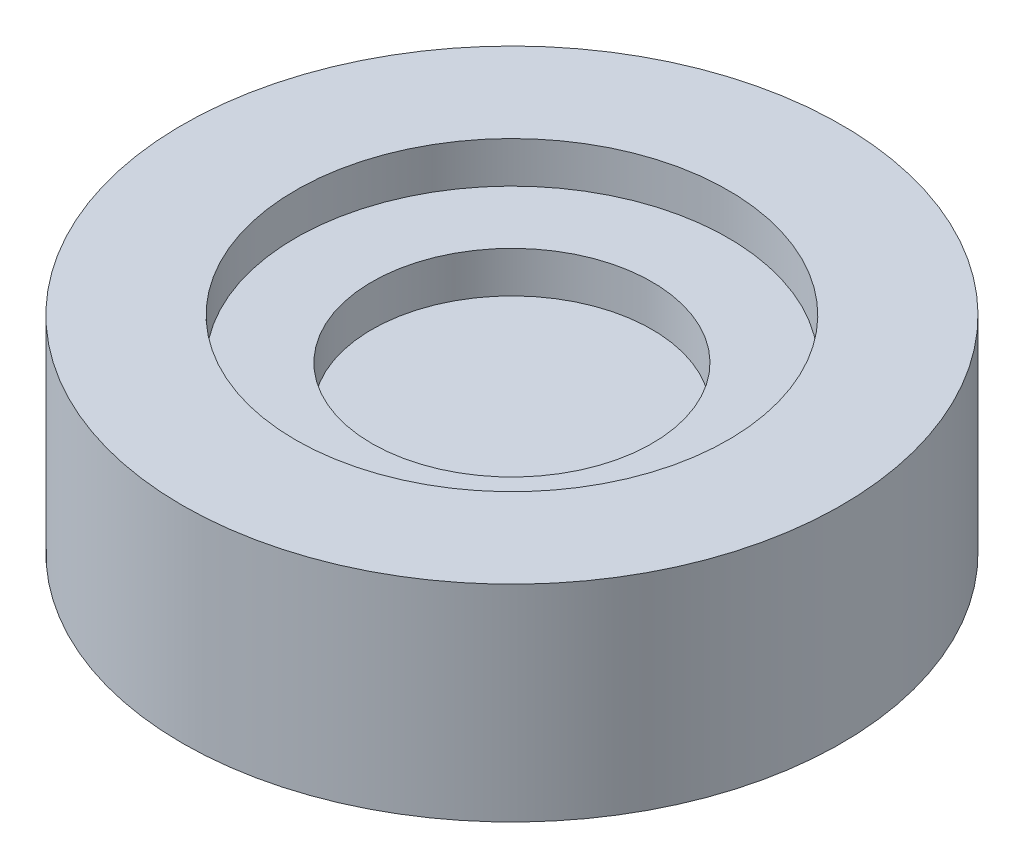
ISO-10303-21;
HEADER;
FILE_DESCRIPTION(('STEP AP214'),'2;1');
FILE_NAME('part.step','',(''),(''),'','','');
FILE_SCHEMA(('AUTOMOTIVE_DESIGN { 1 0 10303 214 1 1 1 1 }'));
ENDSEC;
DATA;
#1=APPLICATION_CONTEXT('core data for automotive mechanical design processes');
#2=APPLICATION_PROTOCOL_DEFINITION('international standard','automotive_design',2000,#1);
#3=PRODUCT_CONTEXT('',#1,'mechanical');
#4=PRODUCT('Part','Part','',(#3));
#5=PRODUCT_RELATED_PRODUCT_CATEGORY('part','',(#4));
#6=PRODUCT_DEFINITION_FORMATION('','',#4);
#7=PRODUCT_DEFINITION_CONTEXT('part definition',#1,'design');
#8=PRODUCT_DEFINITION('design','',#6,#7);
#9=PRODUCT_DEFINITION_SHAPE('','',#8);
#10=(LENGTH_UNIT() NAMED_UNIT(*) SI_UNIT(.MILLI.,.METRE.));
#11=(NAMED_UNIT(*) PLANE_ANGLE_UNIT() SI_UNIT($,.RADIAN.));
#12=(NAMED_UNIT(*) SI_UNIT($,.STERADIAN.) SOLID_ANGLE_UNIT());
#13=UNCERTAINTY_MEASURE_WITH_UNIT(LENGTH_MEASURE(1.E-05),#10,'distance_accuracy_value','');
#14=(GEOMETRIC_REPRESENTATION_CONTEXT(3) GLOBAL_UNCERTAINTY_ASSIGNED_CONTEXT((#13)) GLOBAL_UNIT_ASSIGNED_CONTEXT((#10,
#11,#12)) REPRESENTATION_CONTEXT('',''));
#15=CARTESIAN_POINT('',(0.,0.,0.));
#16=DIRECTION('',(0.,0.,1.));
#17=DIRECTION('',(1.,0.,0.));
#18=AXIS2_PLACEMENT_3D('',#15,#16,#17);
#19=CARTESIAN_POINT('',(0.,5.,0.));
#20=DIRECTION('',(0.,-1.,0.));
#21=DIRECTION('',(0.,0.,-1.));
#22=AXIS2_PLACEMENT_3D('',#19,#20,#21);
#23=CYLINDRICAL_SURFACE('',#22,8.);
#24=CARTESIAN_POINT('',(0.,5.,0.));
#25=DIRECTION('',(0.,1.,0.));
#26=DIRECTION('',(0.,0.,1.));
#27=AXIS2_PLACEMENT_3D('',#24,#25,#26);
#28=CIRCLE('',#27,8.);
#29=CARTESIAN_POINT('',(0.,5.,8.));
#30=VERTEX_POINT('',#29);
#31=EDGE_CURVE('E11',#30,#30,#28,.T.);
#32=ORIENTED_EDGE('',*,*,#31,.F.);
#33=EDGE_LOOP('',(#32));
#34=FACE_BOUND('',#33,.T.);
#35=CARTESIAN_POINT('',(0.,0.,0.));
#36=DIRECTION('',(0.,1.,0.));
#37=DIRECTION('',(0.,0.,1.));
#38=AXIS2_PLACEMENT_3D('',#35,#36,#37);
#39=CIRCLE('',#38,8.);
#40=CARTESIAN_POINT('',(0.,0.,8.));
#41=VERTEX_POINT('',#40);
#42=EDGE_CURVE('E37',#41,#41,#39,.T.);
#43=ORIENTED_EDGE('',*,*,#42,.T.);
#44=EDGE_LOOP('',(#43));
#45=FACE_BOUND('',#44,.T.);
#46=ADVANCED_FACE('F34',(#34,#45),#23,.T.);
#47=CARTESIAN_POINT('',(0.,5.,0.));
#48=DIRECTION('',(0.,1.,0.));
#49=DIRECTION('',(0.,0.,1.));
#50=AXIS2_PLACEMENT_3D('',#47,#48,#49);
#51=PLANE('',#50);
#52=CARTESIAN_POINT('',(0.,5.,0.));
#53=DIRECTION('',(0.,1.,0.));
#54=DIRECTION('',(0.,0.,1.));
#55=AXIS2_PLACEMENT_3D('',#52,#53,#54);
#56=CIRCLE('',#55,5.25);
#57=CARTESIAN_POINT('',(0.,5.,5.25));
#58=VERTEX_POINT('',#57);
#59=EDGE_CURVE('E173',#58,#58,#56,.T.);
#60=ORIENTED_EDGE('',*,*,#59,.F.);
#61=EDGE_LOOP('',(#60));
#62=FACE_BOUND('',#61,.T.);
#63=ORIENTED_EDGE('',*,*,#31,.T.);
#64=EDGE_LOOP('',(#63));
#65=FACE_BOUND('',#64,.T.);
#66=ADVANCED_FACE('F128',(#62,#65),#51,.T.);
#67=CARTESIAN_POINT('',(0.,0.,0.));
#68=DIRECTION('',(0.,1.,0.));
#69=DIRECTION('',(0.,0.,1.));
#70=AXIS2_PLACEMENT_3D('',#67,#68,#69);
#71=PLANE('',#70);
#72=DIRECTION('',(-1.,0.,0.));
#73=VECTOR('',#72,1.);
#74=CARTESIAN_POINT('',(-3.2,0.,1.6));
#75=LINE('',#74,#73);
#76=CARTESIAN_POINT('',(3.2,0.,1.6));
#77=VERTEX_POINT('',#76);
#78=CARTESIAN_POINT('',(-3.2,0.,1.6));
#79=VERTEX_POINT('',#78);
#80=EDGE_CURVE('E83',#77,#79,#75,.T.);
#81=ORIENTED_EDGE('',*,*,#80,.F.);
#82=DIRECTION('',(0.,0.,1.));
#83=VECTOR('',#82,1.);
#84=CARTESIAN_POINT('',(3.2,0.,-1.6));
#85=LINE('',#84,#83);
#86=CARTESIAN_POINT('',(3.2,0.,-1.6));
#87=VERTEX_POINT('',#86);
#88=EDGE_CURVE('E48',#87,#77,#85,.T.);
#89=ORIENTED_EDGE('',*,*,#88,.F.);
#90=DIRECTION('',(1.,0.,0.));
#91=VECTOR('',#90,1.);
#92=CARTESIAN_POINT('',(-3.2,0.,-1.6));
#93=LINE('',#92,#91);
#94=CARTESIAN_POINT('',(-3.2,0.,-1.6));
#95=VERTEX_POINT('',#94);
#96=EDGE_CURVE('E99',#95,#87,#93,.T.);
#97=ORIENTED_EDGE('',*,*,#96,.F.);
#98=DIRECTION('',(0.,0.,-1.));
#99=VECTOR('',#98,1.);
#100=CARTESIAN_POINT('',(-3.2,0.,-1.6));
#101=LINE('',#100,#99);
#102=EDGE_CURVE('E107',#79,#95,#101,.T.);
#103=ORIENTED_EDGE('',*,*,#102,.F.);
#104=EDGE_LOOP('',(#81,#89,#97,#103));
#105=FACE_BOUND('',#104,.T.);
#106=ORIENTED_EDGE('',*,*,#42,.F.);
#107=EDGE_LOOP('',(#106));
#108=FACE_BOUND('',#107,.T.);
#109=ADVANCED_FACE('F113',(#105,#108),#71,.F.);
#110=CARTESIAN_POINT('',(3.2,2.,-1.6));
#111=DIRECTION('',(1.,0.,0.));
#112=DIRECTION('',(0.,0.,-1.));
#113=AXIS2_PLACEMENT_3D('',#110,#111,#112);
#114=PLANE('',#113);
#115=ORIENTED_EDGE('',*,*,#88,.T.);
#116=DIRECTION('',(0.,-1.,0.));
#117=VECTOR('',#116,1.);
#118=CARTESIAN_POINT('',(3.2,2.,1.6));
#119=LINE('',#118,#117);
#120=CARTESIAN_POINT('',(3.2,2.,1.6));
#121=VERTEX_POINT('',#120);
#122=EDGE_CURVE('E71',#121,#77,#119,.T.);
#123=ORIENTED_EDGE('',*,*,#122,.F.);
#124=DIRECTION('',(0.,0.,1.));
#125=VECTOR('',#124,1.);
#126=CARTESIAN_POINT('',(3.2,2.,-1.6));
#127=LINE('',#126,#125);
#128=CARTESIAN_POINT('',(3.2,2.,-1.6));
#129=VERTEX_POINT('',#128);
#130=EDGE_CURVE('E97',#129,#121,#127,.T.);
#131=ORIENTED_EDGE('',*,*,#130,.F.);
#132=DIRECTION('',(0.,-1.,0.));
#133=VECTOR('',#132,1.);
#134=CARTESIAN_POINT('',(3.2,2.,-1.6));
#135=LINE('',#134,#133);
#136=EDGE_CURVE('E56',#129,#87,#135,.T.);
#137=ORIENTED_EDGE('',*,*,#136,.T.);
#138=EDGE_LOOP('',(#115,#123,#131,#137));
#139=FACE_BOUND('',#138,.T.);
#140=ADVANCED_FACE('F118',(#139),#114,.F.);
#141=CARTESIAN_POINT('',(-3.2,2.,-1.6));
#142=DIRECTION('',(0.,0.,-1.));
#143=DIRECTION('',(-1.,0.,0.));
#144=AXIS2_PLACEMENT_3D('',#141,#142,#143);
#145=PLANE('',#144);
#146=ORIENTED_EDGE('',*,*,#96,.T.);
#147=ORIENTED_EDGE('',*,*,#136,.F.);
#148=DIRECTION('',(1.,0.,0.));
#149=VECTOR('',#148,1.);
#150=CARTESIAN_POINT('',(-3.2,2.,-1.6));
#151=LINE('',#150,#149);
#152=CARTESIAN_POINT('',(-3.2,2.,-1.6));
#153=VERTEX_POINT('',#152);
#154=EDGE_CURVE('E94',#153,#129,#151,.T.);
#155=ORIENTED_EDGE('',*,*,#154,.F.);
#156=DIRECTION('',(0.,-1.,0.));
#157=VECTOR('',#156,1.);
#158=CARTESIAN_POINT('',(-3.2,2.,-1.6));
#159=LINE('',#158,#157);
#160=EDGE_CURVE('E87',#153,#95,#159,.T.);
#161=ORIENTED_EDGE('',*,*,#160,.T.);
#162=EDGE_LOOP('',(#146,#147,#155,#161));
#163=FACE_BOUND('',#162,.T.);
#164=ADVANCED_FACE('F116',(#163),#145,.F.);
#165=CARTESIAN_POINT('',(-3.2,2.,-1.6));
#166=DIRECTION('',(-1.,0.,0.));
#167=DIRECTION('',(0.,0.,1.));
#168=AXIS2_PLACEMENT_3D('',#165,#166,#167);
#169=PLANE('',#168);
#170=ORIENTED_EDGE('',*,*,#102,.T.);
#171=ORIENTED_EDGE('',*,*,#160,.F.);
#172=DIRECTION('',(0.,0.,-1.));
#173=VECTOR('',#172,1.);
#174=CARTESIAN_POINT('',(-3.2,2.,-1.6));
#175=LINE('',#174,#173);
#176=CARTESIAN_POINT('',(-3.2,2.,1.6));
#177=VERTEX_POINT('',#176);
#178=EDGE_CURVE('E90',#177,#153,#175,.T.);
#179=ORIENTED_EDGE('',*,*,#178,.F.);
#180=DIRECTION('',(0.,-1.,0.));
#181=VECTOR('',#180,1.);
#182=CARTESIAN_POINT('',(-3.2,2.,1.6));
#183=LINE('',#182,#181);
#184=EDGE_CURVE('E76',#177,#79,#183,.T.);
#185=ORIENTED_EDGE('',*,*,#184,.T.);
#186=EDGE_LOOP('',(#170,#171,#179,#185));
#187=FACE_BOUND('',#186,.T.);
#188=ADVANCED_FACE('F91',(#187),#169,.F.);
#189=CARTESIAN_POINT('',(-3.2,2.,1.6));
#190=DIRECTION('',(0.,0.,1.));
#191=DIRECTION('',(1.,0.,0.));
#192=AXIS2_PLACEMENT_3D('',#189,#190,#191);
#193=PLANE('',#192);
#194=ORIENTED_EDGE('',*,*,#80,.T.);
#195=ORIENTED_EDGE('',*,*,#184,.F.);
#196=DIRECTION('',(-1.,0.,0.));
#197=VECTOR('',#196,1.);
#198=CARTESIAN_POINT('',(-3.2,2.,1.6));
#199=LINE('',#198,#197);
#200=EDGE_CURVE('E80',#121,#177,#199,.T.);
#201=ORIENTED_EDGE('',*,*,#200,.F.);
#202=ORIENTED_EDGE('',*,*,#122,.T.);
#203=EDGE_LOOP('',(#194,#195,#201,#202));
#204=FACE_BOUND('',#203,.T.);
#205=ADVANCED_FACE('F78',(#204),#193,.F.);
#206=CARTESIAN_POINT('',(0.,2.,0.));
#207=DIRECTION('',(0.,1.,0.));
#208=DIRECTION('',(0.,0.,1.));
#209=AXIS2_PLACEMENT_3D('',#206,#207,#208);
#210=PLANE('',#209);
#211=ORIENTED_EDGE('',*,*,#130,.T.);
#212=ORIENTED_EDGE('',*,*,#200,.T.);
#213=ORIENTED_EDGE('',*,*,#178,.T.);
#214=ORIENTED_EDGE('',*,*,#154,.T.);
#215=EDGE_LOOP('',(#211,#212,#213,#214));
#216=FACE_BOUND('',#215,.T.);
#217=ADVANCED_FACE('F96',(#216),#210,.F.);
#218=CARTESIAN_POINT('',(0.,3.,0.));
#219=DIRECTION('',(0.,-1.,0.));
#220=DIRECTION('',(0.,0.,-1.));
#221=AXIS2_PLACEMENT_3D('',#218,#219,#220);
#222=PLANE('',#221);
#223=CARTESIAN_POINT('',(0.,3.,0.));
#224=DIRECTION('',(0.,1.,0.));
#225=DIRECTION('',(0.,0.,1.));
#226=AXIS2_PLACEMENT_3D('',#223,#224,#225);
#227=CIRCLE('',#226,3.4);
#228=CARTESIAN_POINT('',(0.,3.,3.4));
#229=VERTEX_POINT('',#228);
#230=EDGE_CURVE('E105',#229,#229,#227,.T.);
#231=ORIENTED_EDGE('',*,*,#230,.T.);
#232=EDGE_LOOP('',(#231));
#233=FACE_BOUND('',#232,.T.);
#234=ADVANCED_FACE('F147',(#233),#222,.F.);
#235=CARTESIAN_POINT('',(0.,0.,0.));
#236=DIRECTION('',(0.,1.,0.));
#237=DIRECTION('',(0.,0.,1.));
#238=AXIS2_PLACEMENT_3D('',#235,#236,#237);
#239=CYLINDRICAL_SURFACE('',#238,3.4);
#240=ORIENTED_EDGE('',*,*,#230,.F.);
#241=EDGE_LOOP('',(#240));
#242=FACE_BOUND('',#241,.T.);
#243=CARTESIAN_POINT('',(0.,4.,0.));
#244=DIRECTION('',(0.,1.,0.));
#245=DIRECTION('',(0.,0.,1.));
#246=AXIS2_PLACEMENT_3D('',#243,#244,#245);
#247=CIRCLE('',#246,3.4);
#248=CARTESIAN_POINT('',(0.,4.,3.4));
#249=VERTEX_POINT('',#248);
#250=EDGE_CURVE('E175',#249,#249,#247,.T.);
#251=ORIENTED_EDGE('',*,*,#250,.T.);
#252=EDGE_LOOP('',(#251));
#253=FACE_BOUND('',#252,.T.);
#254=ADVANCED_FACE('F151',(#242,#253),#239,.F.);
#255=CARTESIAN_POINT('',(-3.4,4.,0.));
#256=DIRECTION('',(0.,-1.,0.));
#257=DIRECTION('',(0.,0.,-1.));
#258=AXIS2_PLACEMENT_3D('',#255,#256,#257);
#259=PLANE('',#258);
#260=ORIENTED_EDGE('',*,*,#250,.F.);
#261=EDGE_LOOP('',(#260));
#262=FACE_BOUND('',#261,.T.);
#263=CARTESIAN_POINT('',(0.,4.,0.));
#264=DIRECTION('',(0.,1.,0.));
#265=DIRECTION('',(0.,0.,1.));
#266=AXIS2_PLACEMENT_3D('',#263,#264,#265);
#267=CIRCLE('',#266,5.25);
#268=CARTESIAN_POINT('',(0.,4.,5.25));
#269=VERTEX_POINT('',#268);
#270=EDGE_CURVE('E170',#269,#269,#267,.T.);
#271=ORIENTED_EDGE('',*,*,#270,.T.);
#272=EDGE_LOOP('',(#271));
#273=FACE_BOUND('',#272,.T.);
#274=ADVANCED_FACE('F157',(#262,#273),#259,.F.);
#275=CARTESIAN_POINT('',(0.,0.,0.));
#276=DIRECTION('',(0.,1.,0.));
#277=DIRECTION('',(0.,0.,1.));
#278=AXIS2_PLACEMENT_3D('',#275,#276,#277);
#279=CYLINDRICAL_SURFACE('',#278,5.25);
#280=ORIENTED_EDGE('',*,*,#270,.F.);
#281=EDGE_LOOP('',(#280));
#282=FACE_BOUND('',#281,.T.);
#283=ORIENTED_EDGE('',*,*,#59,.T.);
#284=EDGE_LOOP('',(#283));
#285=FACE_BOUND('',#284,.T.);
#286=ADVANCED_FACE('F161',(#282,#285),#279,.F.);
#287=CLOSED_SHELL('',(#46,#66,#109,#140,#164,#188,#205,#217,#234,#254,#274,#286));
#288=MANIFOLD_SOLID_BREP('B2',#287);
#289=ADVANCED_BREP_SHAPE_REPRESENTATION('',(#18,#288),#14);
#290=SHAPE_DEFINITION_REPRESENTATION(#9,#289);
ENDSEC;
END-ISO-10303-21;
